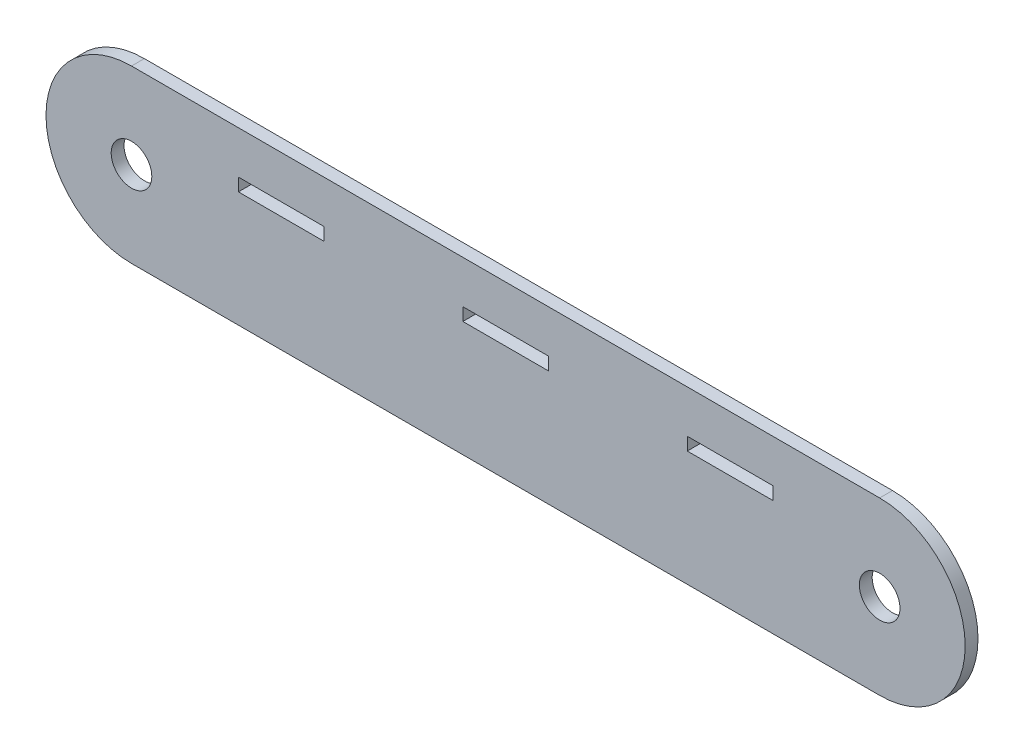
ISO-10303-21;
HEADER;
FILE_DESCRIPTION(('STEP AP214'),'2;1');
FILE_NAME('part.step','',(''),(''),'','','');
FILE_SCHEMA(('AUTOMOTIVE_DESIGN { 1 0 10303 214 1 1 1 1 }'));
ENDSEC;
DATA;
#1=APPLICATION_CONTEXT('core data for automotive mechanical design processes');
#2=APPLICATION_PROTOCOL_DEFINITION('international standard','automotive_design',2000,#1);
#3=PRODUCT_CONTEXT('',#1,'mechanical');
#4=PRODUCT('Part','Part','',(#3));
#5=PRODUCT_RELATED_PRODUCT_CATEGORY('part','',(#4));
#6=PRODUCT_DEFINITION_FORMATION('','',#4);
#7=PRODUCT_DEFINITION_CONTEXT('part definition',#1,'design');
#8=PRODUCT_DEFINITION('design','',#6,#7);
#9=PRODUCT_DEFINITION_SHAPE('','',#8);
#10=(LENGTH_UNIT() NAMED_UNIT(*) SI_UNIT(.MILLI.,.METRE.));
#11=(NAMED_UNIT(*) PLANE_ANGLE_UNIT() SI_UNIT($,.RADIAN.));
#12=(NAMED_UNIT(*) SI_UNIT($,.STERADIAN.) SOLID_ANGLE_UNIT());
#13=UNCERTAINTY_MEASURE_WITH_UNIT(LENGTH_MEASURE(1.E-05),#10,'distance_accuracy_value','');
#14=(GEOMETRIC_REPRESENTATION_CONTEXT(3) GLOBAL_UNCERTAINTY_ASSIGNED_CONTEXT((#13)) GLOBAL_UNIT_ASSIGNED_CONTEXT((#10,
#11,#12)) REPRESENTATION_CONTEXT('',''));
#15=CARTESIAN_POINT('',(0.,0.,0.));
#16=DIRECTION('',(0.,0.,1.));
#17=DIRECTION('',(1.,0.,0.));
#18=AXIS2_PLACEMENT_3D('',#15,#16,#17);
#19=CARTESIAN_POINT('',(-35.5296878485161,2.13114754098369,6.));
#20=DIRECTION('',(0.,0.,1.));
#21=DIRECTION('',(1.,0.,0.));
#22=AXIS2_PLACEMENT_3D('',#19,#20,#21);
#23=PLANE('',#22);
#24=CARTESIAN_POINT('',(-35.5296878485161,2.13114754098369,6.));
#25=DIRECTION('',(0.,0.,1.));
#26=DIRECTION('',(1.,0.,0.));
#27=AXIS2_PLACEMENT_3D('',#24,#25,#26);
#28=CIRCLE('',#27,9.5);
#29=CARTESIAN_POINT('',(-26.0296878485161,2.13114754098369,6.));
#30=VERTEX_POINT('',#29);
#31=EDGE_CURVE('E294',#30,#30,#28,.T.);
#32=ORIENTED_EDGE('',*,*,#31,.F.);
#33=EDGE_LOOP('',(#32));
#34=FACE_BOUND('',#33,.T.);
#35=CARTESIAN_POINT('',(-35.5296878485161,2.13114754098369,6.));
#36=DIRECTION('',(0.,0.,1.));
#37=DIRECTION('',(1.,0.,0.));
#38=AXIS2_PLACEMENT_3D('',#35,#36,#37);
#39=CIRCLE('',#38,40.);
#40=CARTESIAN_POINT('',(-35.5296878485161,42.1311475409837,6.));
#41=VERTEX_POINT('',#40);
#42=CARTESIAN_POINT('',(-35.5296878485161,-37.8688524590163,6.));
#43=VERTEX_POINT('',#42);
#44=EDGE_CURVE('E302',#41,#43,#39,.T.);
#45=ORIENTED_EDGE('',*,*,#44,.T.);
#46=DIRECTION('',(1.,0.,0.));
#47=VECTOR('',#46,1.);
#48=CARTESIAN_POINT('',(-35.5296878485161,-37.8688524590163,6.));
#49=LINE('',#48,#47);
#50=CARTESIAN_POINT('',(314.470312151484,-37.8688524590163,6.));
#51=VERTEX_POINT('',#50);
#52=EDGE_CURVE('E306',#43,#51,#49,.T.);
#53=ORIENTED_EDGE('',*,*,#52,.T.);
#54=CARTESIAN_POINT('',(314.470312151484,2.13114754098369,6.));
#55=DIRECTION('',(0.,0.,1.));
#56=DIRECTION('',(1.,0.,0.));
#57=AXIS2_PLACEMENT_3D('',#54,#55,#56);
#58=CIRCLE('',#57,40.);
#59=CARTESIAN_POINT('',(314.470312151484,42.1311475409837,6.));
#60=VERTEX_POINT('',#59);
#61=EDGE_CURVE('E310',#51,#60,#58,.T.);
#62=ORIENTED_EDGE('',*,*,#61,.T.);
#63=DIRECTION('',(-1.,0.,0.));
#64=VECTOR('',#63,1.);
#65=CARTESIAN_POINT('',(-35.5296878485161,42.1311475409837,6.));
#66=LINE('',#65,#64);
#67=EDGE_CURVE('E313',#60,#41,#66,.T.);
#68=ORIENTED_EDGE('',*,*,#67,.T.);
#69=EDGE_LOOP('',(#45,#53,#62,#68));
#70=FACE_BOUND('',#69,.T.);
#71=CARTESIAN_POINT('',(314.470312151484,2.13114754098369,6.));
#72=DIRECTION('',(0.,0.,1.));
#73=DIRECTION('',(1.,0.,0.));
#74=AXIS2_PLACEMENT_3D('',#71,#72,#73);
#75=CIRCLE('',#74,9.50000000000001);
#76=CARTESIAN_POINT('',(323.970312151484,2.13114754098369,6.));
#77=VERTEX_POINT('',#76);
#78=EDGE_CURVE('E286',#77,#77,#75,.T.);
#79=ORIENTED_EDGE('',*,*,#78,.F.);
#80=EDGE_LOOP('',(#79));
#81=FACE_BOUND('',#80,.T.);
#82=DIRECTION('',(1.,0.,0.));
#83=VECTOR('',#82,1.);
#84=CARTESIAN_POINT('',(159.470312151484,16.1311475409837,6.));
#85=LINE('',#84,#83);
#86=CARTESIAN_POINT('',(119.470312151484,16.1311475409837,6.));
#87=VERTEX_POINT('',#86);
#88=CARTESIAN_POINT('',(159.470312151484,16.1311475409837,6.));
#89=VERTEX_POINT('',#88);
#90=EDGE_CURVE('E246',#87,#89,#85,.T.);
#91=ORIENTED_EDGE('',*,*,#90,.F.);
#92=DIRECTION('',(0.,-1.,0.));
#93=VECTOR('',#92,1.);
#94=CARTESIAN_POINT('',(119.470312151484,16.1311475409837,6.));
#95=LINE('',#94,#93);
#96=CARTESIAN_POINT('',(119.470312151484,22.1311475409837,6.));
#97=VERTEX_POINT('',#96);
#98=EDGE_CURVE('E243',#97,#87,#95,.T.);
#99=ORIENTED_EDGE('',*,*,#98,.F.);
#100=DIRECTION('',(-1.,0.,0.));
#101=VECTOR('',#100,1.);
#102=CARTESIAN_POINT('',(159.470312151484,22.1311475409837,6.));
#103=LINE('',#102,#101);
#104=CARTESIAN_POINT('',(159.470312151484,22.1311475409837,6.));
#105=VERTEX_POINT('',#104);
#106=EDGE_CURVE('E254',#105,#97,#103,.T.);
#107=ORIENTED_EDGE('',*,*,#106,.F.);
#108=DIRECTION('',(0.,1.,0.));
#109=VECTOR('',#108,1.);
#110=CARTESIAN_POINT('',(159.470312151484,16.1311475409837,6.));
#111=LINE('',#110,#109);
#112=EDGE_CURVE('E250',#89,#105,#111,.T.);
#113=ORIENTED_EDGE('',*,*,#112,.F.);
#114=EDGE_LOOP('',(#91,#99,#107,#113));
#115=FACE_BOUND('',#114,.T.);
#116=DIRECTION('',(-1.,0.,0.));
#117=VECTOR('',#116,1.);
#118=CARTESIAN_POINT('',(224.470312151484,22.1311475409837,6.));
#119=LINE('',#118,#117);
#120=CARTESIAN_POINT('',(264.470312151484,22.1311475409837,6.));
#121=VERTEX_POINT('',#120);
#122=CARTESIAN_POINT('',(224.470312151484,22.1311475409837,6.));
#123=VERTEX_POINT('',#122);
#124=EDGE_CURVE('E203',#121,#123,#119,.T.);
#125=ORIENTED_EDGE('',*,*,#124,.F.);
#126=DIRECTION('',(0.,1.,0.));
#127=VECTOR('',#126,1.);
#128=CARTESIAN_POINT('',(264.470312151484,16.1311475409837,6.));
#129=LINE('',#128,#127);
#130=CARTESIAN_POINT('',(264.470312151484,16.1311475409837,6.));
#131=VERTEX_POINT('',#130);
#132=EDGE_CURVE('E200',#131,#121,#129,.T.);
#133=ORIENTED_EDGE('',*,*,#132,.F.);
#134=DIRECTION('',(1.,0.,0.));
#135=VECTOR('',#134,1.);
#136=CARTESIAN_POINT('',(224.470312151484,16.1311475409837,6.));
#137=LINE('',#136,#135);
#138=CARTESIAN_POINT('',(224.470312151484,16.1311475409837,6.));
#139=VERTEX_POINT('',#138);
#140=EDGE_CURVE('E211',#139,#131,#137,.T.);
#141=ORIENTED_EDGE('',*,*,#140,.F.);
#142=DIRECTION('',(0.,-1.,0.));
#143=VECTOR('',#142,1.);
#144=CARTESIAN_POINT('',(224.470312151484,16.1311475409837,6.));
#145=LINE('',#144,#143);
#146=EDGE_CURVE('E207',#123,#139,#145,.T.);
#147=ORIENTED_EDGE('',*,*,#146,.F.);
#148=EDGE_LOOP('',(#125,#133,#141,#147));
#149=FACE_BOUND('',#148,.T.);
#150=DIRECTION('',(1.,0.,0.));
#151=VECTOR('',#150,1.);
#152=CARTESIAN_POINT('',(54.4703121514839,16.1311475409837,6.));
#153=LINE('',#152,#151);
#154=CARTESIAN_POINT('',(14.4703121514839,16.1311475409837,6.));
#155=VERTEX_POINT('',#154);
#156=CARTESIAN_POINT('',(54.4703121514839,16.1311475409837,6.));
#157=VERTEX_POINT('',#156);
#158=EDGE_CURVE('E161',#155,#157,#153,.T.);
#159=ORIENTED_EDGE('',*,*,#158,.F.);
#160=DIRECTION('',(0.,-1.,0.));
#161=VECTOR('',#160,1.);
#162=CARTESIAN_POINT('',(14.4703121514839,16.1311475409837,6.));
#163=LINE('',#162,#161);
#164=CARTESIAN_POINT('',(14.4703121514839,22.1311475409837,6.));
#165=VERTEX_POINT('',#164);
#166=EDGE_CURVE('E152',#165,#155,#163,.T.);
#167=ORIENTED_EDGE('',*,*,#166,.F.);
#168=DIRECTION('',(-1.,0.,0.));
#169=VECTOR('',#168,1.);
#170=CARTESIAN_POINT('',(54.4703121514839,22.1311475409837,6.));
#171=LINE('',#170,#169);
#172=CARTESIAN_POINT('',(54.4703121514839,22.1311475409837,6.));
#173=VERTEX_POINT('',#172);
#174=EDGE_CURVE('E178',#173,#165,#171,.T.);
#175=ORIENTED_EDGE('',*,*,#174,.F.);
#176=DIRECTION('',(0.,1.,0.));
#177=VECTOR('',#176,1.);
#178=CARTESIAN_POINT('',(54.4703121514839,16.1311475409837,6.));
#179=LINE('',#178,#177);
#180=EDGE_CURVE('E174',#157,#173,#179,.T.);
#181=ORIENTED_EDGE('',*,*,#180,.F.);
#182=EDGE_LOOP('',(#159,#167,#175,#181));
#183=FACE_BOUND('',#182,.T.);
#184=ADVANCED_FACE('F38',(#34,#70,#81,#115,#149,#183),#23,.T.);
#185=CARTESIAN_POINT('',(-35.5296878485161,2.13114754098369,0.));
#186=DIRECTION('',(0.,0.,1.));
#187=DIRECTION('',(1.,0.,0.));
#188=AXIS2_PLACEMENT_3D('',#185,#186,#187);
#189=PLANE('',#188);
#190=DIRECTION('',(0.,1.,0.));
#191=VECTOR('',#190,1.);
#192=CARTESIAN_POINT('',(264.470312151484,16.1311475409837,0.));
#193=LINE('',#192,#191);
#194=CARTESIAN_POINT('',(264.470312151484,16.1311475409837,0.));
#195=VERTEX_POINT('',#194);
#196=CARTESIAN_POINT('',(264.470312151484,22.1311475409837,0.));
#197=VERTEX_POINT('',#196);
#198=EDGE_CURVE('E170',#195,#197,#193,.T.);
#199=ORIENTED_EDGE('',*,*,#198,.T.);
#200=DIRECTION('',(-1.,0.,0.));
#201=VECTOR('',#200,1.);
#202=CARTESIAN_POINT('',(224.470312151484,22.1311475409837,0.));
#203=LINE('',#202,#201);
#204=CARTESIAN_POINT('',(224.470312151484,22.1311475409837,0.));
#205=VERTEX_POINT('',#204);
#206=EDGE_CURVE('E218',#197,#205,#203,.T.);
#207=ORIENTED_EDGE('',*,*,#206,.T.);
#208=DIRECTION('',(0.,-1.,0.));
#209=VECTOR('',#208,1.);
#210=CARTESIAN_POINT('',(224.470312151484,16.1311475409837,0.));
#211=LINE('',#210,#209);
#212=CARTESIAN_POINT('',(224.470312151484,16.1311475409837,0.));
#213=VERTEX_POINT('',#212);
#214=EDGE_CURVE('E222',#205,#213,#211,.T.);
#215=ORIENTED_EDGE('',*,*,#214,.T.);
#216=DIRECTION('',(1.,0.,0.));
#217=VECTOR('',#216,1.);
#218=CARTESIAN_POINT('',(224.470312151484,16.1311475409837,0.));
#219=LINE('',#218,#217);
#220=EDGE_CURVE('E204',#213,#195,#219,.T.);
#221=ORIENTED_EDGE('',*,*,#220,.T.);
#222=EDGE_LOOP('',(#199,#207,#215,#221));
#223=FACE_BOUND('',#222,.T.);
#224=CARTESIAN_POINT('',(314.470312151484,2.13114754098369,0.));
#225=DIRECTION('',(0.,0.,1.));
#226=DIRECTION('',(1.,0.,0.));
#227=AXIS2_PLACEMENT_3D('',#224,#225,#226);
#228=CIRCLE('',#227,9.50000000000001);
#229=CARTESIAN_POINT('',(323.970312151484,2.13114754098369,0.));
#230=VERTEX_POINT('',#229);
#231=EDGE_CURVE('E285',#230,#230,#228,.T.);
#232=ORIENTED_EDGE('',*,*,#231,.T.);
#233=EDGE_LOOP('',(#232));
#234=FACE_BOUND('',#233,.T.);
#235=CARTESIAN_POINT('',(-35.5296878485161,2.13114754098369,0.));
#236=DIRECTION('',(0.,0.,1.));
#237=DIRECTION('',(1.,0.,0.));
#238=AXIS2_PLACEMENT_3D('',#235,#236,#237);
#239=CIRCLE('',#238,9.5);
#240=CARTESIAN_POINT('',(-26.0296878485161,2.13114754098369,0.));
#241=VERTEX_POINT('',#240);
#242=EDGE_CURVE('E290',#241,#241,#239,.T.);
#243=ORIENTED_EDGE('',*,*,#242,.T.);
#244=EDGE_LOOP('',(#243));
#245=FACE_BOUND('',#244,.T.);
#246=CARTESIAN_POINT('',(-35.5296878485161,2.13114754098369,0.));
#247=DIRECTION('',(0.,0.,1.));
#248=DIRECTION('',(1.,0.,0.));
#249=AXIS2_PLACEMENT_3D('',#246,#247,#248);
#250=CIRCLE('',#249,40.);
#251=CARTESIAN_POINT('',(-35.5296878485161,42.1311475409837,0.));
#252=VERTEX_POINT('',#251);
#253=CARTESIAN_POINT('',(-35.5296878485161,-37.8688524590163,0.));
#254=VERTEX_POINT('',#253);
#255=EDGE_CURVE('E298',#252,#254,#250,.T.);
#256=ORIENTED_EDGE('',*,*,#255,.F.);
#257=DIRECTION('',(-1.,0.,0.));
#258=VECTOR('',#257,1.);
#259=CARTESIAN_POINT('',(-35.5296878485161,42.1311475409837,0.));
#260=LINE('',#259,#258);
#261=CARTESIAN_POINT('',(314.470312151484,42.1311475409837,0.));
#262=VERTEX_POINT('',#261);
#263=EDGE_CURVE('E307',#262,#252,#260,.T.);
#264=ORIENTED_EDGE('',*,*,#263,.F.);
#265=CARTESIAN_POINT('',(314.470312151484,2.13114754098369,0.));
#266=DIRECTION('',(0.,0.,1.));
#267=DIRECTION('',(1.,0.,0.));
#268=AXIS2_PLACEMENT_3D('',#265,#266,#267);
#269=CIRCLE('',#268,40.);
#270=CARTESIAN_POINT('',(314.470312151484,-37.8688524590163,0.));
#271=VERTEX_POINT('',#270);
#272=EDGE_CURVE('E323',#271,#262,#269,.T.);
#273=ORIENTED_EDGE('',*,*,#272,.F.);
#274=DIRECTION('',(1.,0.,0.));
#275=VECTOR('',#274,1.);
#276=CARTESIAN_POINT('',(-35.5296878485161,-37.8688524590163,0.));
#277=LINE('',#276,#275);
#278=EDGE_CURVE('E320',#254,#271,#277,.T.);
#279=ORIENTED_EDGE('',*,*,#278,.F.);
#280=EDGE_LOOP('',(#256,#264,#273,#279));
#281=FACE_BOUND('',#280,.T.);
#282=DIRECTION('',(0.,-1.,0.));
#283=VECTOR('',#282,1.);
#284=CARTESIAN_POINT('',(119.470312151484,16.1311475409837,0.));
#285=LINE('',#284,#283);
#286=CARTESIAN_POINT('',(119.470312151484,22.1311475409837,0.));
#287=VERTEX_POINT('',#286);
#288=CARTESIAN_POINT('',(119.470312151484,16.1311475409837,0.));
#289=VERTEX_POINT('',#288);
#290=EDGE_CURVE('E242',#287,#289,#285,.T.);
#291=ORIENTED_EDGE('',*,*,#290,.T.);
#292=DIRECTION('',(1.,0.,0.));
#293=VECTOR('',#292,1.);
#294=CARTESIAN_POINT('',(159.470312151484,16.1311475409837,0.));
#295=LINE('',#294,#293);
#296=CARTESIAN_POINT('',(159.470312151484,16.1311475409837,0.));
#297=VERTEX_POINT('',#296);
#298=EDGE_CURVE('E261',#289,#297,#295,.T.);
#299=ORIENTED_EDGE('',*,*,#298,.T.);
#300=DIRECTION('',(0.,1.,0.));
#301=VECTOR('',#300,1.);
#302=CARTESIAN_POINT('',(159.470312151484,16.1311475409837,0.));
#303=LINE('',#302,#301);
#304=CARTESIAN_POINT('',(159.470312151484,22.1311475409837,0.));
#305=VERTEX_POINT('',#304);
#306=EDGE_CURVE('E265',#297,#305,#303,.T.);
#307=ORIENTED_EDGE('',*,*,#306,.T.);
#308=DIRECTION('',(-1.,0.,0.));
#309=VECTOR('',#308,1.);
#310=CARTESIAN_POINT('',(159.470312151484,22.1311475409837,0.));
#311=LINE('',#310,#309);
#312=EDGE_CURVE('E247',#305,#287,#311,.T.);
#313=ORIENTED_EDGE('',*,*,#312,.T.);
#314=EDGE_LOOP('',(#291,#299,#307,#313));
#315=FACE_BOUND('',#314,.T.);
#316=DIRECTION('',(0.,-1.,0.));
#317=VECTOR('',#316,1.);
#318=CARTESIAN_POINT('',(14.4703121514839,16.1311475409837,0.));
#319=LINE('',#318,#317);
#320=CARTESIAN_POINT('',(14.4703121514839,22.1311475409837,0.));
#321=VERTEX_POINT('',#320);
#322=CARTESIAN_POINT('',(14.4703121514839,16.1311475409837,0.));
#323=VERTEX_POINT('',#322);
#324=EDGE_CURVE('E62',#321,#323,#319,.T.);
#325=ORIENTED_EDGE('',*,*,#324,.T.);
#326=DIRECTION('',(1.,0.,0.));
#327=VECTOR('',#326,1.);
#328=CARTESIAN_POINT('',(54.4703121514839,16.1311475409837,0.));
#329=LINE('',#328,#327);
#330=CARTESIAN_POINT('',(54.4703121514839,16.1311475409837,0.));
#331=VERTEX_POINT('',#330);
#332=EDGE_CURVE('E168',#323,#331,#329,.T.);
#333=ORIENTED_EDGE('',*,*,#332,.T.);
#334=DIRECTION('',(0.,1.,0.));
#335=VECTOR('',#334,1.);
#336=CARTESIAN_POINT('',(54.4703121514839,16.1311475409837,0.));
#337=LINE('',#336,#335);
#338=CARTESIAN_POINT('',(54.4703121514839,22.1311475409837,0.));
#339=VERTEX_POINT('',#338);
#340=EDGE_CURVE('E187',#331,#339,#337,.T.);
#341=ORIENTED_EDGE('',*,*,#340,.T.);
#342=DIRECTION('',(-1.,0.,0.));
#343=VECTOR('',#342,1.);
#344=CARTESIAN_POINT('',(54.4703121514839,22.1311475409837,0.));
#345=LINE('',#344,#343);
#346=EDGE_CURVE('E162',#339,#321,#345,.T.);
#347=ORIENTED_EDGE('',*,*,#346,.T.);
#348=EDGE_LOOP('',(#325,#333,#341,#347));
#349=FACE_BOUND('',#348,.T.);
#350=ADVANCED_FACE('F346',(#223,#234,#245,#281,#315,#349),#189,.F.);
#351=CARTESIAN_POINT('',(-35.5296878485161,2.13114754098369,6.));
#352=DIRECTION('',(0.,0.,-1.));
#353=DIRECTION('',(-1.,0.,0.));
#354=AXIS2_PLACEMENT_3D('',#351,#352,#353);
#355=CYLINDRICAL_SURFACE('',#354,40.);
#356=ORIENTED_EDGE('',*,*,#255,.T.);
#357=DIRECTION('',(0.,0.,-1.));
#358=VECTOR('',#357,1.);
#359=CARTESIAN_POINT('',(-35.5296878485161,-37.8688524590163,6.));
#360=LINE('',#359,#358);
#361=EDGE_CURVE('E11',#43,#254,#360,.T.);
#362=ORIENTED_EDGE('',*,*,#361,.F.);
#363=ORIENTED_EDGE('',*,*,#44,.F.);
#364=DIRECTION('',(0.,0.,-1.));
#365=VECTOR('',#364,1.);
#366=CARTESIAN_POINT('',(-35.5296878485161,42.1311475409837,6.));
#367=LINE('',#366,#365);
#368=EDGE_CURVE('E316',#41,#252,#367,.T.);
#369=ORIENTED_EDGE('',*,*,#368,.T.);
#370=EDGE_LOOP('',(#356,#362,#363,#369));
#371=FACE_BOUND('',#370,.T.);
#372=ADVANCED_FACE('F40',(#371),#355,.T.);
#373=CARTESIAN_POINT('',(-35.5296878485161,-37.8688524590163,6.));
#374=DIRECTION('',(0.,1.,0.));
#375=DIRECTION('',(-1.,0.,0.));
#376=AXIS2_PLACEMENT_3D('',#373,#374,#375);
#377=PLANE('',#376);
#378=ORIENTED_EDGE('',*,*,#278,.T.);
#379=DIRECTION('',(0.,0.,-1.));
#380=VECTOR('',#379,1.);
#381=CARTESIAN_POINT('',(314.470312151484,-37.8688524590163,6.));
#382=LINE('',#381,#380);
#383=EDGE_CURVE('E47',#51,#271,#382,.T.);
#384=ORIENTED_EDGE('',*,*,#383,.F.);
#385=ORIENTED_EDGE('',*,*,#52,.F.);
#386=ORIENTED_EDGE('',*,*,#361,.T.);
#387=EDGE_LOOP('',(#378,#384,#385,#386));
#388=FACE_BOUND('',#387,.T.);
#389=ADVANCED_FACE('F357',(#388),#377,.F.);
#390=CARTESIAN_POINT('',(314.470312151484,2.13114754098369,6.));
#391=DIRECTION('',(0.,0.,-1.));
#392=DIRECTION('',(-1.,0.,0.));
#393=AXIS2_PLACEMENT_3D('',#390,#391,#392);
#394=CYLINDRICAL_SURFACE('',#393,40.);
#395=ORIENTED_EDGE('',*,*,#272,.T.);
#396=DIRECTION('',(0.,0.,-1.));
#397=VECTOR('',#396,1.);
#398=CARTESIAN_POINT('',(314.470312151484,42.1311475409837,6.));
#399=LINE('',#398,#397);
#400=EDGE_CURVE('E331',#60,#262,#399,.T.);
#401=ORIENTED_EDGE('',*,*,#400,.F.);
#402=ORIENTED_EDGE('',*,*,#61,.F.);
#403=ORIENTED_EDGE('',*,*,#383,.T.);
#404=EDGE_LOOP('',(#395,#401,#402,#403));
#405=FACE_BOUND('',#404,.T.);
#406=ADVANCED_FACE('F340',(#405),#394,.T.);
#407=CARTESIAN_POINT('',(-35.5296878485161,42.1311475409837,6.));
#408=DIRECTION('',(0.,-1.,0.));
#409=DIRECTION('',(1.,0.,0.));
#410=AXIS2_PLACEMENT_3D('',#407,#408,#409);
#411=PLANE('',#410);
#412=ORIENTED_EDGE('',*,*,#263,.T.);
#413=ORIENTED_EDGE('',*,*,#368,.F.);
#414=ORIENTED_EDGE('',*,*,#67,.F.);
#415=ORIENTED_EDGE('',*,*,#400,.T.);
#416=EDGE_LOOP('',(#412,#413,#414,#415));
#417=FACE_BOUND('',#416,.T.);
#418=ADVANCED_FACE('F350',(#417),#411,.F.);
#419=CARTESIAN_POINT('',(-35.5296878485161,2.13114754098369,6.));
#420=DIRECTION('',(0.,0.,-1.));
#421=DIRECTION('',(-1.,0.,0.));
#422=AXIS2_PLACEMENT_3D('',#419,#420,#421);
#423=CYLINDRICAL_SURFACE('',#422,9.5);
#424=ORIENTED_EDGE('',*,*,#31,.T.);
#425=EDGE_LOOP('',(#424));
#426=FACE_BOUND('',#425,.T.);
#427=ORIENTED_EDGE('',*,*,#242,.F.);
#428=EDGE_LOOP('',(#427));
#429=FACE_BOUND('',#428,.T.);
#430=ADVANCED_FACE('F374',(#426,#429),#423,.F.);
#431=CARTESIAN_POINT('',(314.470312151484,2.13114754098369,6.));
#432=DIRECTION('',(0.,0.,-1.));
#433=DIRECTION('',(-1.,0.,0.));
#434=AXIS2_PLACEMENT_3D('',#431,#432,#433);
#435=CYLINDRICAL_SURFACE('',#434,9.50000000000001);
#436=ORIENTED_EDGE('',*,*,#78,.T.);
#437=EDGE_LOOP('',(#436));
#438=FACE_BOUND('',#437,.T.);
#439=ORIENTED_EDGE('',*,*,#231,.F.);
#440=EDGE_LOOP('',(#439));
#441=FACE_BOUND('',#440,.T.);
#442=ADVANCED_FACE('F381',(#438,#441),#435,.F.);
#443=CARTESIAN_POINT('',(119.470312151484,16.1311475409837,6.));
#444=DIRECTION('',(1.,0.,0.));
#445=DIRECTION('',(0.,0.,-1.));
#446=AXIS2_PLACEMENT_3D('',#443,#444,#445);
#447=PLANE('',#446);
#448=ORIENTED_EDGE('',*,*,#290,.F.);
#449=DIRECTION('',(0.,0.,-1.));
#450=VECTOR('',#449,1.);
#451=CARTESIAN_POINT('',(119.470312151484,22.1311475409837,6.));
#452=LINE('',#451,#450);
#453=EDGE_CURVE('E257',#97,#287,#452,.T.);
#454=ORIENTED_EDGE('',*,*,#453,.F.);
#455=ORIENTED_EDGE('',*,*,#98,.T.);
#456=DIRECTION('',(0.,0.,-1.));
#457=VECTOR('',#456,1.);
#458=CARTESIAN_POINT('',(119.470312151484,16.1311475409837,6.));
#459=LINE('',#458,#457);
#460=EDGE_CURVE('E281',#87,#289,#459,.T.);
#461=ORIENTED_EDGE('',*,*,#460,.T.);
#462=EDGE_LOOP('',(#448,#454,#455,#461));
#463=FACE_BOUND('',#462,.T.);
#464=ADVANCED_FACE('F386',(#463),#447,.T.);
#465=CARTESIAN_POINT('',(159.470312151484,16.1311475409837,6.));
#466=DIRECTION('',(0.,1.,0.));
#467=DIRECTION('',(-1.,0.,0.));
#468=AXIS2_PLACEMENT_3D('',#465,#466,#467);
#469=PLANE('',#468);
#470=ORIENTED_EDGE('',*,*,#298,.F.);
#471=ORIENTED_EDGE('',*,*,#460,.F.);
#472=ORIENTED_EDGE('',*,*,#90,.T.);
#473=DIRECTION('',(0.,0.,-1.));
#474=VECTOR('',#473,1.);
#475=CARTESIAN_POINT('',(159.470312151484,16.1311475409837,6.));
#476=LINE('',#475,#474);
#477=EDGE_CURVE('E278',#89,#297,#476,.T.);
#478=ORIENTED_EDGE('',*,*,#477,.T.);
#479=EDGE_LOOP('',(#470,#471,#472,#478));
#480=FACE_BOUND('',#479,.T.);
#481=ADVANCED_FACE('F394',(#480),#469,.T.);
#482=CARTESIAN_POINT('',(159.470312151484,16.1311475409837,6.));
#483=DIRECTION('',(-1.,0.,0.));
#484=DIRECTION('',(0.,0.,1.));
#485=AXIS2_PLACEMENT_3D('',#482,#483,#484);
#486=PLANE('',#485);
#487=ORIENTED_EDGE('',*,*,#306,.F.);
#488=ORIENTED_EDGE('',*,*,#477,.F.);
#489=ORIENTED_EDGE('',*,*,#112,.T.);
#490=DIRECTION('',(0.,0.,-1.));
#491=VECTOR('',#490,1.);
#492=CARTESIAN_POINT('',(159.470312151484,22.1311475409837,6.));
#493=LINE('',#492,#491);
#494=EDGE_CURVE('E275',#105,#305,#493,.T.);
#495=ORIENTED_EDGE('',*,*,#494,.T.);
#496=EDGE_LOOP('',(#487,#488,#489,#495));
#497=FACE_BOUND('',#496,.T.);
#498=ADVANCED_FACE('F401',(#497),#486,.T.);
#499=CARTESIAN_POINT('',(159.470312151484,22.1311475409837,6.));
#500=DIRECTION('',(0.,-1.,0.));
#501=DIRECTION('',(1.,0.,0.));
#502=AXIS2_PLACEMENT_3D('',#499,#500,#501);
#503=PLANE('',#502);
#504=ORIENTED_EDGE('',*,*,#312,.F.);
#505=ORIENTED_EDGE('',*,*,#494,.F.);
#506=ORIENTED_EDGE('',*,*,#106,.T.);
#507=ORIENTED_EDGE('',*,*,#453,.T.);
#508=EDGE_LOOP('',(#504,#505,#506,#507));
#509=FACE_BOUND('',#508,.T.);
#510=ADVANCED_FACE('F405',(#509),#503,.T.);
#511=CARTESIAN_POINT('',(264.470312151484,16.1311475409837,6.));
#512=DIRECTION('',(-1.,0.,0.));
#513=DIRECTION('',(0.,0.,1.));
#514=AXIS2_PLACEMENT_3D('',#511,#512,#513);
#515=PLANE('',#514);
#516=ORIENTED_EDGE('',*,*,#198,.F.);
#517=DIRECTION('',(0.,0.,-1.));
#518=VECTOR('',#517,1.);
#519=CARTESIAN_POINT('',(264.470312151484,16.1311475409837,6.));
#520=LINE('',#519,#518);
#521=EDGE_CURVE('E214',#131,#195,#520,.T.);
#522=ORIENTED_EDGE('',*,*,#521,.F.);
#523=ORIENTED_EDGE('',*,*,#132,.T.);
#524=DIRECTION('',(0.,0.,-1.));
#525=VECTOR('',#524,1.);
#526=CARTESIAN_POINT('',(264.470312151484,22.1311475409837,6.));
#527=LINE('',#526,#525);
#528=EDGE_CURVE('E238',#121,#197,#527,.T.);
#529=ORIENTED_EDGE('',*,*,#528,.T.);
#530=EDGE_LOOP('',(#516,#522,#523,#529));
#531=FACE_BOUND('',#530,.T.);
#532=ADVANCED_FACE('F409',(#531),#515,.T.);
#533=CARTESIAN_POINT('',(224.470312151484,22.1311475409837,6.));
#534=DIRECTION('',(0.,-1.,0.));
#535=DIRECTION('',(0.,0.,-1.));
#536=AXIS2_PLACEMENT_3D('',#533,#534,#535);
#537=PLANE('',#536);
#538=ORIENTED_EDGE('',*,*,#206,.F.);
#539=ORIENTED_EDGE('',*,*,#528,.F.);
#540=ORIENTED_EDGE('',*,*,#124,.T.);
#541=DIRECTION('',(0.,0.,-1.));
#542=VECTOR('',#541,1.);
#543=CARTESIAN_POINT('',(224.470312151484,22.1311475409837,6.));
#544=LINE('',#543,#542);
#545=EDGE_CURVE('E235',#123,#205,#544,.T.);
#546=ORIENTED_EDGE('',*,*,#545,.T.);
#547=EDGE_LOOP('',(#538,#539,#540,#546));
#548=FACE_BOUND('',#547,.T.);
#549=ADVANCED_FACE('F413',(#548),#537,.T.);
#550=CARTESIAN_POINT('',(224.470312151484,16.1311475409837,6.));
#551=DIRECTION('',(1.,0.,0.));
#552=DIRECTION('',(0.,0.,-1.));
#553=AXIS2_PLACEMENT_3D('',#550,#551,#552);
#554=PLANE('',#553);
#555=ORIENTED_EDGE('',*,*,#214,.F.);
#556=ORIENTED_EDGE('',*,*,#545,.F.);
#557=ORIENTED_EDGE('',*,*,#146,.T.);
#558=DIRECTION('',(0.,0.,-1.));
#559=VECTOR('',#558,1.);
#560=CARTESIAN_POINT('',(224.470312151484,16.1311475409837,6.));
#561=LINE('',#560,#559);
#562=EDGE_CURVE('E232',#139,#213,#561,.T.);
#563=ORIENTED_EDGE('',*,*,#562,.T.);
#564=EDGE_LOOP('',(#555,#556,#557,#563));
#565=FACE_BOUND('',#564,.T.);
#566=ADVANCED_FACE('F417',(#565),#554,.T.);
#567=CARTESIAN_POINT('',(224.470312151484,16.1311475409837,6.));
#568=DIRECTION('',(0.,1.,0.));
#569=DIRECTION('',(0.,0.,1.));
#570=AXIS2_PLACEMENT_3D('',#567,#568,#569);
#571=PLANE('',#570);
#572=ORIENTED_EDGE('',*,*,#220,.F.);
#573=ORIENTED_EDGE('',*,*,#562,.F.);
#574=ORIENTED_EDGE('',*,*,#140,.T.);
#575=ORIENTED_EDGE('',*,*,#521,.T.);
#576=EDGE_LOOP('',(#572,#573,#574,#575));
#577=FACE_BOUND('',#576,.T.);
#578=ADVANCED_FACE('F421',(#577),#571,.T.);
#579=CARTESIAN_POINT('',(14.4703121514839,16.1311475409837,6.));
#580=DIRECTION('',(1.,0.,0.));
#581=DIRECTION('',(0.,0.,-1.));
#582=AXIS2_PLACEMENT_3D('',#579,#580,#581);
#583=PLANE('',#582);
#584=ORIENTED_EDGE('',*,*,#324,.F.);
#585=DIRECTION('',(0.,0.,-1.));
#586=VECTOR('',#585,1.);
#587=CARTESIAN_POINT('',(14.4703121514839,22.1311475409837,6.));
#588=LINE('',#587,#586);
#589=EDGE_CURVE('E156',#165,#321,#588,.T.);
#590=ORIENTED_EDGE('',*,*,#589,.F.);
#591=ORIENTED_EDGE('',*,*,#166,.T.);
#592=DIRECTION('',(0.,0.,-1.));
#593=VECTOR('',#592,1.);
#594=CARTESIAN_POINT('',(14.4703121514839,16.1311475409837,6.));
#595=LINE('',#594,#593);
#596=EDGE_CURVE('E155',#155,#323,#595,.T.);
#597=ORIENTED_EDGE('',*,*,#596,.T.);
#598=EDGE_LOOP('',(#584,#590,#591,#597));
#599=FACE_BOUND('',#598,.T.);
#600=ADVANCED_FACE('F154',(#599),#583,.T.);
#601=CARTESIAN_POINT('',(54.4703121514839,16.1311475409837,6.));
#602=DIRECTION('',(0.,1.,0.));
#603=DIRECTION('',(-1.,0.,0.));
#604=AXIS2_PLACEMENT_3D('',#601,#602,#603);
#605=PLANE('',#604);
#606=ORIENTED_EDGE('',*,*,#332,.F.);
#607=ORIENTED_EDGE('',*,*,#596,.F.);
#608=ORIENTED_EDGE('',*,*,#158,.T.);
#609=DIRECTION('',(0.,0.,-1.));
#610=VECTOR('',#609,1.);
#611=CARTESIAN_POINT('',(54.4703121514839,16.1311475409837,6.));
#612=LINE('',#611,#610);
#613=EDGE_CURVE('E171',#157,#331,#612,.T.);
#614=ORIENTED_EDGE('',*,*,#613,.T.);
#615=EDGE_LOOP('',(#606,#607,#608,#614));
#616=FACE_BOUND('',#615,.T.);
#617=ADVANCED_FACE('F165',(#616),#605,.T.);
#618=CARTESIAN_POINT('',(54.4703121514839,16.1311475409837,6.));
#619=DIRECTION('',(-1.,0.,0.));
#620=DIRECTION('',(0.,0.,1.));
#621=AXIS2_PLACEMENT_3D('',#618,#619,#620);
#622=PLANE('',#621);
#623=ORIENTED_EDGE('',*,*,#340,.F.);
#624=ORIENTED_EDGE('',*,*,#613,.F.);
#625=ORIENTED_EDGE('',*,*,#180,.T.);
#626=DIRECTION('',(0.,0.,-1.));
#627=VECTOR('',#626,1.);
#628=CARTESIAN_POINT('',(54.4703121514839,22.1311475409837,6.));
#629=LINE('',#628,#627);
#630=EDGE_CURVE('E54',#173,#339,#629,.T.);
#631=ORIENTED_EDGE('',*,*,#630,.T.);
#632=EDGE_LOOP('',(#623,#624,#625,#631));
#633=FACE_BOUND('',#632,.T.);
#634=ADVANCED_FACE('F430',(#633),#622,.T.);
#635=CARTESIAN_POINT('',(54.4703121514839,22.1311475409837,6.));
#636=DIRECTION('',(0.,-1.,0.));
#637=DIRECTION('',(1.,0.,0.));
#638=AXIS2_PLACEMENT_3D('',#635,#636,#637);
#639=PLANE('',#638);
#640=ORIENTED_EDGE('',*,*,#346,.F.);
#641=ORIENTED_EDGE('',*,*,#630,.F.);
#642=ORIENTED_EDGE('',*,*,#174,.T.);
#643=ORIENTED_EDGE('',*,*,#589,.T.);
#644=EDGE_LOOP('',(#640,#641,#642,#643));
#645=FACE_BOUND('',#644,.T.);
#646=ADVANCED_FACE('F433',(#645),#639,.T.);
#647=CLOSED_SHELL('',(#184,#350,#372,#389,#406,#418,#430,#442,#464,#481,#498,#510,#532,#549,
#566,#578,#600,#617,#634,#646));
#648=MANIFOLD_SOLID_BREP('B2',#647);
#649=ADVANCED_BREP_SHAPE_REPRESENTATION('',(#18,#648),#14);
#650=SHAPE_DEFINITION_REPRESENTATION(#9,#649);
ENDSEC;
END-ISO-10303-21;
